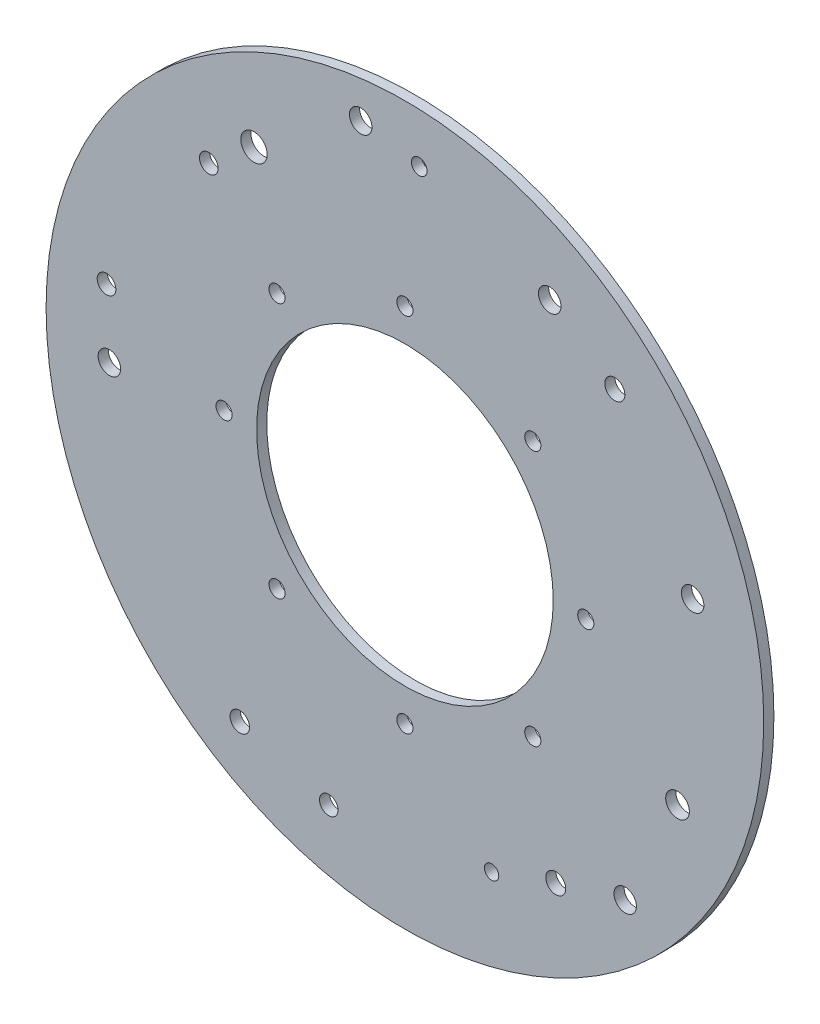
ISO-10303-21;
HEADER;
FILE_DESCRIPTION(('STEP AP214'),'2;1');
FILE_NAME('part.step','',(''),(''),'','','');
FILE_SCHEMA(('AUTOMOTIVE_DESIGN { 1 0 10303 214 1 1 1 1 }'));
ENDSEC;
DATA;
#1=APPLICATION_CONTEXT('core data for automotive mechanical design processes');
#2=APPLICATION_PROTOCOL_DEFINITION('international standard','automotive_design',2000,#1);
#3=PRODUCT_CONTEXT('',#1,'mechanical');
#4=PRODUCT('Part','Part','',(#3));
#5=PRODUCT_RELATED_PRODUCT_CATEGORY('part','',(#4));
#6=PRODUCT_DEFINITION_FORMATION('','',#4);
#7=PRODUCT_DEFINITION_CONTEXT('part definition',#1,'design');
#8=PRODUCT_DEFINITION('design','',#6,#7);
#9=PRODUCT_DEFINITION_SHAPE('','',#8);
#10=(LENGTH_UNIT() NAMED_UNIT(*) SI_UNIT(.MILLI.,.METRE.));
#11=(NAMED_UNIT(*) PLANE_ANGLE_UNIT() SI_UNIT($,.RADIAN.));
#12=(NAMED_UNIT(*) SI_UNIT($,.STERADIAN.) SOLID_ANGLE_UNIT());
#13=UNCERTAINTY_MEASURE_WITH_UNIT(LENGTH_MEASURE(1.E-05),#10,'distance_accuracy_value','');
#14=(GEOMETRIC_REPRESENTATION_CONTEXT(3) GLOBAL_UNCERTAINTY_ASSIGNED_CONTEXT((#13)) GLOBAL_UNIT_ASSIGNED_CONTEXT((#10,
#11,#12)) REPRESENTATION_CONTEXT('',''));
#15=CARTESIAN_POINT('',(0.,0.,0.));
#16=DIRECTION('',(0.,0.,1.));
#17=DIRECTION('',(1.,0.,0.));
#18=AXIS2_PLACEMENT_3D('',#15,#16,#17);
#19=CARTESIAN_POINT('',(0.,0.,6.));
#20=DIRECTION('',(0.,0.,1.));
#21=DIRECTION('',(1.,0.,0.));
#22=AXIS2_PLACEMENT_3D('',#19,#20,#21);
#23=PLANE('',#22);
#24=CARTESIAN_POINT('',(106.68,1.11741368768336E-12,6.));
#25=DIRECTION('',(0.,0.,1.));
#26=DIRECTION('',(1.,0.,0.));
#27=AXIS2_PLACEMENT_3D('',#24,#25,#26);
#28=CIRCLE('',#27,4.7625);
#29=CARTESIAN_POINT('',(111.4425,1.11741368768336E-12,6.));
#30=VERTEX_POINT('',#29);
#31=EDGE_CURVE('E183',#30,#30,#28,.T.);
#32=ORIENTED_EDGE('',*,*,#31,.F.);
#33=EDGE_LOOP('',(#32));
#34=FACE_BOUND('',#33,.T.);
#35=CARTESIAN_POINT('',(75.4341514169816,-75.4341514169802,6.));
#36=DIRECTION('',(0.,0.,1.));
#37=DIRECTION('',(1.,0.,0.));
#38=AXIS2_PLACEMENT_3D('',#35,#36,#37);
#39=CIRCLE('',#38,4.7625);
#40=CARTESIAN_POINT('',(80.1966514169816,-75.4341514169802,6.));
#41=VERTEX_POINT('',#40);
#42=EDGE_CURVE('E177',#41,#41,#39,.T.);
#43=ORIENTED_EDGE('',*,*,#42,.F.);
#44=EDGE_LOOP('',(#43));
#45=FACE_BOUND('',#44,.T.);
#46=CARTESIAN_POINT('',(0.,-106.68,6.));
#47=DIRECTION('',(0.,0.,1.));
#48=DIRECTION('',(1.,0.,0.));
#49=AXIS2_PLACEMENT_3D('',#46,#47,#48);
#50=CIRCLE('',#49,4.7625);
#51=CARTESIAN_POINT('',(4.7625,-106.68,6.));
#52=VERTEX_POINT('',#51);
#53=EDGE_CURVE('E171',#52,#52,#50,.T.);
#54=ORIENTED_EDGE('',*,*,#53,.F.);
#55=EDGE_LOOP('',(#54));
#56=FACE_BOUND('',#55,.T.);
#57=CARTESIAN_POINT('',(-75.434151416981,-75.4341514169808,6.));
#58=DIRECTION('',(0.,0.,1.));
#59=DIRECTION('',(1.,0.,0.));
#60=AXIS2_PLACEMENT_3D('',#57,#58,#59);
#61=CIRCLE('',#60,4.7625);
#62=CARTESIAN_POINT('',(-70.671651416981,-75.4341514169808,6.));
#63=VERTEX_POINT('',#62);
#64=EDGE_CURVE('E165',#63,#63,#61,.T.);
#65=ORIENTED_EDGE('',*,*,#64,.F.);
#66=EDGE_LOOP('',(#65));
#67=FACE_BOUND('',#66,.T.);
#68=CARTESIAN_POINT('',(-106.68,-3.72471229227785E-13,6.));
#69=DIRECTION('',(0.,0.,1.));
#70=DIRECTION('',(1.,0.,0.));
#71=AXIS2_PLACEMENT_3D('',#68,#69,#70);
#72=CIRCLE('',#71,4.7625);
#73=CARTESIAN_POINT('',(-101.9175,-3.72471229227785E-13,6.));
#74=VERTEX_POINT('',#73);
#75=EDGE_CURVE('E159',#74,#74,#72,.T.);
#76=ORIENTED_EDGE('',*,*,#75,.F.);
#77=EDGE_LOOP('',(#76));
#78=FACE_BOUND('',#77,.T.);
#79=CARTESIAN_POINT('',(-75.434151416981,75.4341514169808,6.));
#80=DIRECTION('',(0.,0.,1.));
#81=DIRECTION('',(1.,0.,0.));
#82=AXIS2_PLACEMENT_3D('',#79,#80,#81);
#83=CIRCLE('',#82,4.7625);
#84=CARTESIAN_POINT('',(-70.671651416981,75.4341514169808,6.));
#85=VERTEX_POINT('',#84);
#86=EDGE_CURVE('E153',#85,#85,#83,.T.);
#87=ORIENTED_EDGE('',*,*,#86,.F.);
#88=EDGE_LOOP('',(#87));
#89=FACE_BOUND('',#88,.T.);
#90=CARTESIAN_POINT('',(0.,106.68,6.));
#91=DIRECTION('',(0.,0.,1.));
#92=DIRECTION('',(1.,0.,0.));
#93=AXIS2_PLACEMENT_3D('',#90,#91,#92);
#94=CIRCLE('',#93,4.7625);
#95=CARTESIAN_POINT('',(4.7625,106.68,6.));
#96=VERTEX_POINT('',#95);
#97=EDGE_CURVE('E147',#96,#96,#94,.T.);
#98=ORIENTED_EDGE('',*,*,#97,.F.);
#99=EDGE_LOOP('',(#98));
#100=FACE_BOUND('',#99,.T.);
#101=CARTESIAN_POINT('',(75.434151416981,75.4341514169808,6.));
#102=DIRECTION('',(0.,0.,1.));
#103=DIRECTION('',(1.,0.,0.));
#104=AXIS2_PLACEMENT_3D('',#101,#102,#103);
#105=CIRCLE('',#104,4.7625);
#106=CARTESIAN_POINT('',(80.196651416981,75.4341514169808,6.));
#107=VERTEX_POINT('',#106);
#108=EDGE_CURVE('E141',#107,#107,#105,.T.);
#109=ORIENTED_EDGE('',*,*,#108,.F.);
#110=EDGE_LOOP('',(#109));
#111=FACE_BOUND('',#110,.T.);
#112=CARTESIAN_POINT('',(0.,0.,6.));
#113=DIRECTION('',(0.,0.,1.));
#114=DIRECTION('',(1.,0.,0.));
#115=AXIS2_PLACEMENT_3D('',#112,#113,#114);
#116=CIRCLE('',#115,87.5);
#117=CARTESIAN_POINT('',(87.5,0.,6.));
#118=VERTEX_POINT('',#117);
#119=EDGE_CURVE('E133',#118,#118,#116,.T.);
#120=ORIENTED_EDGE('',*,*,#119,.F.);
#121=EDGE_LOOP('',(#120));
#122=FACE_BOUND('',#121,.T.);
#123=CARTESIAN_POINT('',(169.7101,41.9354,6.));
#124=DIRECTION('',(0.,0.,1.));
#125=DIRECTION('',(1.,0.,0.));
#126=AXIS2_PLACEMENT_3D('',#123,#124,#125);
#127=CIRCLE('',#126,6.6421);
#128=CARTESIAN_POINT('',(176.3522,41.9354,6.));
#129=VERTEX_POINT('',#128);
#130=EDGE_CURVE('E118',#129,#129,#127,.T.);
#131=ORIENTED_EDGE('',*,*,#130,.F.);
#132=EDGE_LOOP('',(#131));
#133=FACE_BOUND('',#132,.T.);
#134=CARTESIAN_POINT('',(85.42274,152.58034,6.));
#135=DIRECTION('',(0.,0.,1.));
#136=DIRECTION('',(1.,0.,0.));
#137=AXIS2_PLACEMENT_3D('',#134,#135,#136);
#138=CIRCLE('',#137,6.6421);
#139=CARTESIAN_POINT('',(92.06484,152.58034,6.));
#140=VERTEX_POINT('',#139);
#141=EDGE_CURVE('E106',#140,#140,#138,.T.);
#142=ORIENTED_EDGE('',*,*,#141,.F.);
#143=EDGE_LOOP('',(#142));
#144=FACE_BOUND('',#143,.T.);
#145=CARTESIAN_POINT('',(-26.09596,188.2775,6.));
#146=DIRECTION('',(0.,0.,1.));
#147=DIRECTION('',(1.,0.,0.));
#148=AXIS2_PLACEMENT_3D('',#145,#146,#147);
#149=CIRCLE('',#148,6.64209999999999);
#150=CARTESIAN_POINT('',(-19.45386,188.2775,6.));
#151=VERTEX_POINT('',#150);
#152=EDGE_CURVE('E94',#151,#151,#149,.T.);
#153=ORIENTED_EDGE('',*,*,#152,.F.);
#154=EDGE_LOOP('',(#153));
#155=FACE_BOUND('',#154,.T.);
#156=CARTESIAN_POINT('',(-176.0118908,29.95676,6.));
#157=DIRECTION('',(0.,0.,1.));
#158=DIRECTION('',(1.,0.,0.));
#159=AXIS2_PLACEMENT_3D('',#156,#157,#158);
#160=CIRCLE('',#159,5.49910000000001);
#161=CARTESIAN_POINT('',(-170.5127908,29.95676,6.));
#162=VERTEX_POINT('',#161);
#163=EDGE_CURVE('E82',#162,#162,#160,.T.);
#164=ORIENTED_EDGE('',*,*,#163,.F.);
#165=EDGE_LOOP('',(#164));
#166=FACE_BOUND('',#165,.T.);
#167=CARTESIAN_POINT('',(-97.40392,-154.3431,6.));
#168=DIRECTION('',(0.,0.,1.));
#169=DIRECTION('',(1.,0.,0.));
#170=AXIS2_PLACEMENT_3D('',#167,#168,#169);
#171=CIRCLE('',#170,5.7531);
#172=CARTESIAN_POINT('',(-91.65082,-154.3431,6.));
#173=VERTEX_POINT('',#172);
#174=EDGE_CURVE('E70',#173,#173,#171,.T.);
#175=ORIENTED_EDGE('',*,*,#174,.F.);
#176=EDGE_LOOP('',(#175));
#177=FACE_BOUND('',#176,.T.);
#178=CARTESIAN_POINT('',(51.13274,-156.81706,6.));
#179=DIRECTION('',(0.,0.,1.));
#180=DIRECTION('',(1.,0.,0.));
#181=AXIS2_PLACEMENT_3D('',#178,#179,#180);
#182=CIRCLE('',#181,4.2291);
#183=CARTESIAN_POINT('',(55.36184,-156.81706,6.));
#184=VERTEX_POINT('',#183);
#185=EDGE_CURVE('E58',#184,#184,#182,.T.);
#186=ORIENTED_EDGE('',*,*,#185,.F.);
#187=EDGE_LOOP('',(#186));
#188=FACE_BOUND('',#187,.T.);
#189=CARTESIAN_POINT('',(129.93116,-131.74726,6.));
#190=DIRECTION('',(0.,0.,1.));
#191=DIRECTION('',(1.,0.,0.));
#192=AXIS2_PLACEMENT_3D('',#189,#190,#191);
#193=CIRCLE('',#192,6.6294);
#194=CARTESIAN_POINT('',(136.56056,-131.74726,6.));
#195=VERTEX_POINT('',#194);
#196=EDGE_CURVE('E46',#195,#195,#193,.T.);
#197=ORIENTED_EDGE('',*,*,#196,.F.);
#198=EDGE_LOOP('',(#197));
#199=FACE_BOUND('',#198,.T.);
#200=CARTESIAN_POINT('',(0.,0.,6.));
#201=DIRECTION('',(0.,0.,1.));
#202=DIRECTION('',(1.,0.,0.));
#203=AXIS2_PLACEMENT_3D('',#200,#201,#202);
#204=CIRCLE('',#203,211.670411634821);
#205=CARTESIAN_POINT('',(211.670411634821,0.,6.));
#206=VERTEX_POINT('',#205);
#207=EDGE_CURVE('E10',#206,#206,#204,.T.);
#208=ORIENTED_EDGE('',*,*,#207,.T.);
#209=EDGE_LOOP('',(#208));
#210=FACE_BOUND('',#209,.T.);
#211=CARTESIAN_POINT('',(160.80232,-67.72402,6.));
#212=DIRECTION('',(0.,0.,1.));
#213=DIRECTION('',(1.,0.,0.));
#214=AXIS2_PLACEMENT_3D('',#211,#212,#213);
#215=CIRCLE('',#214,6.98499999999998);
#216=CARTESIAN_POINT('',(167.78732,-67.72402,6.));
#217=VERTEX_POINT('',#216);
#218=EDGE_CURVE('E41',#217,#217,#215,.T.);
#219=ORIENTED_EDGE('',*,*,#218,.F.);
#220=EDGE_LOOP('',(#219));
#221=FACE_BOUND('',#220,.T.);
#222=CARTESIAN_POINT('',(88.98382,-143.60906,6.));
#223=DIRECTION('',(0.,0.,1.));
#224=DIRECTION('',(1.,0.,0.));
#225=AXIS2_PLACEMENT_3D('',#222,#223,#224);
#226=CIRCLE('',#225,5.8928);
#227=CARTESIAN_POINT('',(94.87662,-143.60906,6.));
#228=VERTEX_POINT('',#227);
#229=EDGE_CURVE('E52',#228,#228,#226,.T.);
#230=ORIENTED_EDGE('',*,*,#229,.F.);
#231=EDGE_LOOP('',(#230));
#232=FACE_BOUND('',#231,.T.);
#233=CARTESIAN_POINT('',(-44.93006,-170.61434,6.));
#234=DIRECTION('',(0.,0.,1.));
#235=DIRECTION('',(1.,0.,0.));
#236=AXIS2_PLACEMENT_3D('',#233,#234,#235);
#237=CIRCLE('',#236,5.461);
#238=CARTESIAN_POINT('',(-39.46906,-170.61434,6.));
#239=VERTEX_POINT('',#238);
#240=EDGE_CURVE('E64',#239,#239,#237,.T.);
#241=ORIENTED_EDGE('',*,*,#240,.F.);
#242=EDGE_LOOP('',(#241));
#243=FACE_BOUND('',#242,.T.);
#244=CARTESIAN_POINT('',(-174.33036,-9.32688,6.));
#245=DIRECTION('',(0.,0.,1.));
#246=DIRECTION('',(1.,0.,0.));
#247=AXIS2_PLACEMENT_3D('',#244,#245,#246);
#248=CIRCLE('',#247,6.6294);
#249=CARTESIAN_POINT('',(-167.70096,-9.32688,6.));
#250=VERTEX_POINT('',#249);
#251=EDGE_CURVE('E76',#250,#250,#248,.T.);
#252=ORIENTED_EDGE('',*,*,#251,.F.);
#253=EDGE_LOOP('',(#252));
#254=FACE_BOUND('',#253,.T.);
#255=CARTESIAN_POINT('',(-89.03716,143.4338,6.));
#256=DIRECTION('',(0.,0.,1.));
#257=DIRECTION('',(1.,0.,0.));
#258=AXIS2_PLACEMENT_3D('',#255,#256,#257);
#259=CIRCLE('',#258,7.79779999999999);
#260=CARTESIAN_POINT('',(-81.23936,143.4338,6.));
#261=VERTEX_POINT('',#260);
#262=EDGE_CURVE('E88',#261,#261,#259,.T.);
#263=ORIENTED_EDGE('',*,*,#262,.F.);
#264=EDGE_LOOP('',(#263));
#265=FACE_BOUND('',#264,.T.);
#266=CARTESIAN_POINT('',(8.42771999999997,182.19674,6.));
#267=DIRECTION('',(0.,0.,1.));
#268=DIRECTION('',(1.,0.,0.));
#269=AXIS2_PLACEMENT_3D('',#266,#267,#268);
#270=CIRCLE('',#269,4.6228);
#271=CARTESIAN_POINT('',(13.05052,182.19674,6.));
#272=VERTEX_POINT('',#271);
#273=EDGE_CURVE('E100',#272,#272,#270,.T.);
#274=ORIENTED_EDGE('',*,*,#273,.F.);
#275=EDGE_LOOP('',(#274));
#276=FACE_BOUND('',#275,.T.);
#277=CARTESIAN_POINT('',(123.8123,126.18466,6.));
#278=DIRECTION('',(0.,0.,1.));
#279=DIRECTION('',(1.,0.,0.));
#280=AXIS2_PLACEMENT_3D('',#277,#278,#279);
#281=CIRCLE('',#280,5.91819999999999);
#282=CARTESIAN_POINT('',(129.7305,126.18466,6.));
#283=VERTEX_POINT('',#282);
#284=EDGE_CURVE('E112',#283,#283,#281,.T.);
#285=ORIENTED_EDGE('',*,*,#284,.F.);
#286=EDGE_LOOP('',(#285));
#287=FACE_BOUND('',#286,.T.);
#288=CARTESIAN_POINT('',(-115.69192,121.86666,6.));
#289=DIRECTION('',(0.,0.,1.));
#290=DIRECTION('',(1.,0.,0.));
#291=AXIS2_PLACEMENT_3D('',#288,#289,#290);
#292=CIRCLE('',#291,5.49910000000001);
#293=CARTESIAN_POINT('',(-110.19282,121.86666,6.));
#294=VERTEX_POINT('',#293);
#295=EDGE_CURVE('E124',#294,#294,#292,.T.);
#296=ORIENTED_EDGE('',*,*,#295,.F.);
#297=EDGE_LOOP('',(#296));
#298=FACE_BOUND('',#297,.T.);
#299=ADVANCED_FACE('F30',(#34,#45,#56,#67,#78,#89,#100,#111,#122,#133,#144,#155,#166,#177,#188,
#199,#210,#221,#232,#243,#254,#265,#276,#287,#298),#23,.T.);
#300=CARTESIAN_POINT('',(0.,0.,0.));
#301=DIRECTION('',(0.,0.,1.));
#302=DIRECTION('',(1.,0.,0.));
#303=AXIS2_PLACEMENT_3D('',#300,#301,#302);
#304=PLANE('',#303);
#305=CARTESIAN_POINT('',(106.68,1.11741368768336E-12,0.));
#306=DIRECTION('',(0.,0.,1.));
#307=DIRECTION('',(1.,0.,0.));
#308=AXIS2_PLACEMENT_3D('',#305,#306,#307);
#309=CIRCLE('',#308,4.7625);
#310=CARTESIAN_POINT('',(111.4425,1.11741368768336E-12,0.));
#311=VERTEX_POINT('',#310);
#312=EDGE_CURVE('E180',#311,#311,#309,.T.);
#313=ORIENTED_EDGE('',*,*,#312,.T.);
#314=EDGE_LOOP('',(#313));
#315=FACE_BOUND('',#314,.T.);
#316=CARTESIAN_POINT('',(75.4341514169816,-75.4341514169802,0.));
#317=DIRECTION('',(0.,0.,1.));
#318=DIRECTION('',(1.,0.,0.));
#319=AXIS2_PLACEMENT_3D('',#316,#317,#318);
#320=CIRCLE('',#319,4.7625);
#321=CARTESIAN_POINT('',(80.1966514169816,-75.4341514169802,0.));
#322=VERTEX_POINT('',#321);
#323=EDGE_CURVE('E174',#322,#322,#320,.T.);
#324=ORIENTED_EDGE('',*,*,#323,.T.);
#325=EDGE_LOOP('',(#324));
#326=FACE_BOUND('',#325,.T.);
#327=CARTESIAN_POINT('',(0.,-106.68,0.));
#328=DIRECTION('',(0.,0.,1.));
#329=DIRECTION('',(1.,0.,0.));
#330=AXIS2_PLACEMENT_3D('',#327,#328,#329);
#331=CIRCLE('',#330,4.7625);
#332=CARTESIAN_POINT('',(4.7625,-106.68,0.));
#333=VERTEX_POINT('',#332);
#334=EDGE_CURVE('E168',#333,#333,#331,.T.);
#335=ORIENTED_EDGE('',*,*,#334,.T.);
#336=EDGE_LOOP('',(#335));
#337=FACE_BOUND('',#336,.T.);
#338=CARTESIAN_POINT('',(-75.434151416981,-75.4341514169808,0.));
#339=DIRECTION('',(0.,0.,1.));
#340=DIRECTION('',(1.,0.,0.));
#341=AXIS2_PLACEMENT_3D('',#338,#339,#340);
#342=CIRCLE('',#341,4.7625);
#343=CARTESIAN_POINT('',(-70.671651416981,-75.4341514169808,0.));
#344=VERTEX_POINT('',#343);
#345=EDGE_CURVE('E162',#344,#344,#342,.T.);
#346=ORIENTED_EDGE('',*,*,#345,.T.);
#347=EDGE_LOOP('',(#346));
#348=FACE_BOUND('',#347,.T.);
#349=CARTESIAN_POINT('',(-106.68,-3.72471229227785E-13,0.));
#350=DIRECTION('',(0.,0.,1.));
#351=DIRECTION('',(1.,0.,0.));
#352=AXIS2_PLACEMENT_3D('',#349,#350,#351);
#353=CIRCLE('',#352,4.7625);
#354=CARTESIAN_POINT('',(-101.9175,-3.72471229227785E-13,0.));
#355=VERTEX_POINT('',#354);
#356=EDGE_CURVE('E156',#355,#355,#353,.T.);
#357=ORIENTED_EDGE('',*,*,#356,.T.);
#358=EDGE_LOOP('',(#357));
#359=FACE_BOUND('',#358,.T.);
#360=CARTESIAN_POINT('',(-75.434151416981,75.4341514169808,0.));
#361=DIRECTION('',(0.,0.,1.));
#362=DIRECTION('',(1.,0.,0.));
#363=AXIS2_PLACEMENT_3D('',#360,#361,#362);
#364=CIRCLE('',#363,4.7625);
#365=CARTESIAN_POINT('',(-70.671651416981,75.4341514169808,0.));
#366=VERTEX_POINT('',#365);
#367=EDGE_CURVE('E150',#366,#366,#364,.T.);
#368=ORIENTED_EDGE('',*,*,#367,.T.);
#369=EDGE_LOOP('',(#368));
#370=FACE_BOUND('',#369,.T.);
#371=CARTESIAN_POINT('',(0.,106.68,0.));
#372=DIRECTION('',(0.,0.,1.));
#373=DIRECTION('',(1.,0.,0.));
#374=AXIS2_PLACEMENT_3D('',#371,#372,#373);
#375=CIRCLE('',#374,4.7625);
#376=CARTESIAN_POINT('',(4.7625,106.68,0.));
#377=VERTEX_POINT('',#376);
#378=EDGE_CURVE('E144',#377,#377,#375,.T.);
#379=ORIENTED_EDGE('',*,*,#378,.T.);
#380=EDGE_LOOP('',(#379));
#381=FACE_BOUND('',#380,.T.);
#382=CARTESIAN_POINT('',(75.434151416981,75.4341514169808,0.));
#383=DIRECTION('',(0.,0.,1.));
#384=DIRECTION('',(1.,0.,0.));
#385=AXIS2_PLACEMENT_3D('',#382,#383,#384);
#386=CIRCLE('',#385,4.7625);
#387=CARTESIAN_POINT('',(80.196651416981,75.4341514169808,0.));
#388=VERTEX_POINT('',#387);
#389=EDGE_CURVE('E136',#388,#388,#386,.T.);
#390=ORIENTED_EDGE('',*,*,#389,.T.);
#391=EDGE_LOOP('',(#390));
#392=FACE_BOUND('',#391,.T.);
#393=CARTESIAN_POINT('',(0.,0.,0.));
#394=DIRECTION('',(0.,0.,1.));
#395=DIRECTION('',(1.,0.,0.));
#396=AXIS2_PLACEMENT_3D('',#393,#394,#395);
#397=CIRCLE('',#396,87.5);
#398=CARTESIAN_POINT('',(87.5,0.,0.));
#399=VERTEX_POINT('',#398);
#400=EDGE_CURVE('E130',#399,#399,#397,.T.);
#401=ORIENTED_EDGE('',*,*,#400,.T.);
#402=EDGE_LOOP('',(#401));
#403=FACE_BOUND('',#402,.T.);
#404=CARTESIAN_POINT('',(0.,0.,0.));
#405=DIRECTION('',(0.,0.,1.));
#406=DIRECTION('',(1.,0.,0.));
#407=AXIS2_PLACEMENT_3D('',#404,#405,#406);
#408=CIRCLE('',#407,211.670411634821);
#409=CARTESIAN_POINT('',(211.670411634821,0.,0.));
#410=VERTEX_POINT('',#409);
#411=EDGE_CURVE('E34',#410,#410,#408,.T.);
#412=ORIENTED_EDGE('',*,*,#411,.F.);
#413=EDGE_LOOP('',(#412));
#414=FACE_BOUND('',#413,.T.);
#415=CARTESIAN_POINT('',(160.80232,-67.72402,0.));
#416=DIRECTION('',(0.,0.,1.));
#417=DIRECTION('',(1.,0.,0.));
#418=AXIS2_PLACEMENT_3D('',#415,#416,#417);
#419=CIRCLE('',#418,6.98499999999998);
#420=CARTESIAN_POINT('',(167.78732,-67.72402,0.));
#421=VERTEX_POINT('',#420);
#422=EDGE_CURVE('E43',#421,#421,#419,.T.);
#423=ORIENTED_EDGE('',*,*,#422,.T.);
#424=EDGE_LOOP('',(#423));
#425=FACE_BOUND('',#424,.T.);
#426=CARTESIAN_POINT('',(129.93116,-131.74726,0.));
#427=DIRECTION('',(0.,0.,1.));
#428=DIRECTION('',(1.,0.,0.));
#429=AXIS2_PLACEMENT_3D('',#426,#427,#428);
#430=CIRCLE('',#429,6.6294);
#431=CARTESIAN_POINT('',(136.56056,-131.74726,0.));
#432=VERTEX_POINT('',#431);
#433=EDGE_CURVE('E49',#432,#432,#430,.T.);
#434=ORIENTED_EDGE('',*,*,#433,.T.);
#435=EDGE_LOOP('',(#434));
#436=FACE_BOUND('',#435,.T.);
#437=CARTESIAN_POINT('',(88.98382,-143.60906,0.));
#438=DIRECTION('',(0.,0.,1.));
#439=DIRECTION('',(1.,0.,0.));
#440=AXIS2_PLACEMENT_3D('',#437,#438,#439);
#441=CIRCLE('',#440,5.8928);
#442=CARTESIAN_POINT('',(94.87662,-143.60906,0.));
#443=VERTEX_POINT('',#442);
#444=EDGE_CURVE('E55',#443,#443,#441,.T.);
#445=ORIENTED_EDGE('',*,*,#444,.T.);
#446=EDGE_LOOP('',(#445));
#447=FACE_BOUND('',#446,.T.);
#448=CARTESIAN_POINT('',(51.13274,-156.81706,0.));
#449=DIRECTION('',(0.,0.,1.));
#450=DIRECTION('',(1.,0.,0.));
#451=AXIS2_PLACEMENT_3D('',#448,#449,#450);
#452=CIRCLE('',#451,4.2291);
#453=CARTESIAN_POINT('',(55.36184,-156.81706,0.));
#454=VERTEX_POINT('',#453);
#455=EDGE_CURVE('E61',#454,#454,#452,.T.);
#456=ORIENTED_EDGE('',*,*,#455,.T.);
#457=EDGE_LOOP('',(#456));
#458=FACE_BOUND('',#457,.T.);
#459=CARTESIAN_POINT('',(-44.93006,-170.61434,0.));
#460=DIRECTION('',(0.,0.,1.));
#461=DIRECTION('',(1.,0.,0.));
#462=AXIS2_PLACEMENT_3D('',#459,#460,#461);
#463=CIRCLE('',#462,5.461);
#464=CARTESIAN_POINT('',(-39.46906,-170.61434,0.));
#465=VERTEX_POINT('',#464);
#466=EDGE_CURVE('E67',#465,#465,#463,.T.);
#467=ORIENTED_EDGE('',*,*,#466,.T.);
#468=EDGE_LOOP('',(#467));
#469=FACE_BOUND('',#468,.T.);
#470=CARTESIAN_POINT('',(-97.40392,-154.3431,0.));
#471=DIRECTION('',(0.,0.,1.));
#472=DIRECTION('',(1.,0.,0.));
#473=AXIS2_PLACEMENT_3D('',#470,#471,#472);
#474=CIRCLE('',#473,5.7531);
#475=CARTESIAN_POINT('',(-91.65082,-154.3431,0.));
#476=VERTEX_POINT('',#475);
#477=EDGE_CURVE('E73',#476,#476,#474,.T.);
#478=ORIENTED_EDGE('',*,*,#477,.T.);
#479=EDGE_LOOP('',(#478));
#480=FACE_BOUND('',#479,.T.);
#481=CARTESIAN_POINT('',(-174.33036,-9.32688,0.));
#482=DIRECTION('',(0.,0.,1.));
#483=DIRECTION('',(1.,0.,0.));
#484=AXIS2_PLACEMENT_3D('',#481,#482,#483);
#485=CIRCLE('',#484,6.6294);
#486=CARTESIAN_POINT('',(-167.70096,-9.32688,0.));
#487=VERTEX_POINT('',#486);
#488=EDGE_CURVE('E79',#487,#487,#485,.T.);
#489=ORIENTED_EDGE('',*,*,#488,.T.);
#490=EDGE_LOOP('',(#489));
#491=FACE_BOUND('',#490,.T.);
#492=CARTESIAN_POINT('',(-176.0118908,29.95676,0.));
#493=DIRECTION('',(0.,0.,1.));
#494=DIRECTION('',(1.,0.,0.));
#495=AXIS2_PLACEMENT_3D('',#492,#493,#494);
#496=CIRCLE('',#495,5.49910000000001);
#497=CARTESIAN_POINT('',(-170.5127908,29.95676,0.));
#498=VERTEX_POINT('',#497);
#499=EDGE_CURVE('E85',#498,#498,#496,.T.);
#500=ORIENTED_EDGE('',*,*,#499,.T.);
#501=EDGE_LOOP('',(#500));
#502=FACE_BOUND('',#501,.T.);
#503=CARTESIAN_POINT('',(-89.03716,143.4338,0.));
#504=DIRECTION('',(0.,0.,1.));
#505=DIRECTION('',(1.,0.,0.));
#506=AXIS2_PLACEMENT_3D('',#503,#504,#505);
#507=CIRCLE('',#506,7.79779999999999);
#508=CARTESIAN_POINT('',(-81.23936,143.4338,0.));
#509=VERTEX_POINT('',#508);
#510=EDGE_CURVE('E91',#509,#509,#507,.T.);
#511=ORIENTED_EDGE('',*,*,#510,.T.);
#512=EDGE_LOOP('',(#511));
#513=FACE_BOUND('',#512,.T.);
#514=CARTESIAN_POINT('',(-26.09596,188.2775,0.));
#515=DIRECTION('',(0.,0.,1.));
#516=DIRECTION('',(1.,0.,0.));
#517=AXIS2_PLACEMENT_3D('',#514,#515,#516);
#518=CIRCLE('',#517,6.64209999999999);
#519=CARTESIAN_POINT('',(-19.45386,188.2775,0.));
#520=VERTEX_POINT('',#519);
#521=EDGE_CURVE('E97',#520,#520,#518,.T.);
#522=ORIENTED_EDGE('',*,*,#521,.T.);
#523=EDGE_LOOP('',(#522));
#524=FACE_BOUND('',#523,.T.);
#525=CARTESIAN_POINT('',(8.42771999999997,182.19674,0.));
#526=DIRECTION('',(0.,0.,1.));
#527=DIRECTION('',(1.,0.,0.));
#528=AXIS2_PLACEMENT_3D('',#525,#526,#527);
#529=CIRCLE('',#528,4.6228);
#530=CARTESIAN_POINT('',(13.05052,182.19674,0.));
#531=VERTEX_POINT('',#530);
#532=EDGE_CURVE('E103',#531,#531,#529,.T.);
#533=ORIENTED_EDGE('',*,*,#532,.T.);
#534=EDGE_LOOP('',(#533));
#535=FACE_BOUND('',#534,.T.);
#536=CARTESIAN_POINT('',(85.42274,152.58034,0.));
#537=DIRECTION('',(0.,0.,1.));
#538=DIRECTION('',(1.,0.,0.));
#539=AXIS2_PLACEMENT_3D('',#536,#537,#538);
#540=CIRCLE('',#539,6.6421);
#541=CARTESIAN_POINT('',(92.06484,152.58034,0.));
#542=VERTEX_POINT('',#541);
#543=EDGE_CURVE('E109',#542,#542,#540,.T.);
#544=ORIENTED_EDGE('',*,*,#543,.T.);
#545=EDGE_LOOP('',(#544));
#546=FACE_BOUND('',#545,.T.);
#547=CARTESIAN_POINT('',(123.8123,126.18466,0.));
#548=DIRECTION('',(0.,0.,1.));
#549=DIRECTION('',(1.,0.,0.));
#550=AXIS2_PLACEMENT_3D('',#547,#548,#549);
#551=CIRCLE('',#550,5.91819999999999);
#552=CARTESIAN_POINT('',(129.7305,126.18466,0.));
#553=VERTEX_POINT('',#552);
#554=EDGE_CURVE('E115',#553,#553,#551,.T.);
#555=ORIENTED_EDGE('',*,*,#554,.T.);
#556=EDGE_LOOP('',(#555));
#557=FACE_BOUND('',#556,.T.);
#558=CARTESIAN_POINT('',(169.7101,41.9354,0.));
#559=DIRECTION('',(0.,0.,1.));
#560=DIRECTION('',(1.,0.,0.));
#561=AXIS2_PLACEMENT_3D('',#558,#559,#560);
#562=CIRCLE('',#561,6.6421);
#563=CARTESIAN_POINT('',(176.3522,41.9354,0.));
#564=VERTEX_POINT('',#563);
#565=EDGE_CURVE('E121',#564,#564,#562,.T.);
#566=ORIENTED_EDGE('',*,*,#565,.T.);
#567=EDGE_LOOP('',(#566));
#568=FACE_BOUND('',#567,.T.);
#569=CARTESIAN_POINT('',(-115.69192,121.86666,0.));
#570=DIRECTION('',(0.,0.,1.));
#571=DIRECTION('',(1.,0.,0.));
#572=AXIS2_PLACEMENT_3D('',#569,#570,#571);
#573=CIRCLE('',#572,5.49910000000001);
#574=CARTESIAN_POINT('',(-110.19282,121.86666,0.));
#575=VERTEX_POINT('',#574);
#576=EDGE_CURVE('E127',#575,#575,#573,.T.);
#577=ORIENTED_EDGE('',*,*,#576,.T.);
#578=EDGE_LOOP('',(#577));
#579=FACE_BOUND('',#578,.T.);
#580=ADVANCED_FACE('F191',(#315,#326,#337,#348,#359,#370,#381,#392,#403,#414,#425,#436,#447,
#458,#469,#480,#491,#502,#513,#524,#535,#546,#557,#568,#579),#304,.F.);
#581=CARTESIAN_POINT('',(0.,0.,6.));
#582=DIRECTION('',(0.,0.,-1.));
#583=DIRECTION('',(-1.,0.,0.));
#584=AXIS2_PLACEMENT_3D('',#581,#582,#583);
#585=CYLINDRICAL_SURFACE('',#584,211.670411634821);
#586=ORIENTED_EDGE('',*,*,#207,.F.);
#587=EDGE_LOOP('',(#586));
#588=FACE_BOUND('',#587,.T.);
#589=ORIENTED_EDGE('',*,*,#411,.T.);
#590=EDGE_LOOP('',(#589));
#591=FACE_BOUND('',#590,.T.);
#592=ADVANCED_FACE('F32',(#588,#591),#585,.T.);
#593=CARTESIAN_POINT('',(160.80232,-67.72402,6.));
#594=DIRECTION('',(0.,0.,-1.));
#595=DIRECTION('',(-1.,0.,0.));
#596=AXIS2_PLACEMENT_3D('',#593,#594,#595);
#597=CYLINDRICAL_SURFACE('',#596,6.98499999999998);
#598=ORIENTED_EDGE('',*,*,#218,.T.);
#599=EDGE_LOOP('',(#598));
#600=FACE_BOUND('',#599,.T.);
#601=ORIENTED_EDGE('',*,*,#422,.F.);
#602=EDGE_LOOP('',(#601));
#603=FACE_BOUND('',#602,.T.);
#604=ADVANCED_FACE('F252',(#600,#603),#597,.F.);
#605=CARTESIAN_POINT('',(129.93116,-131.74726,6.));
#606=DIRECTION('',(0.,0.,-1.));
#607=DIRECTION('',(-1.,0.,0.));
#608=AXIS2_PLACEMENT_3D('',#605,#606,#607);
#609=CYLINDRICAL_SURFACE('',#608,6.6294);
#610=ORIENTED_EDGE('',*,*,#196,.T.);
#611=EDGE_LOOP('',(#610));
#612=FACE_BOUND('',#611,.T.);
#613=ORIENTED_EDGE('',*,*,#433,.F.);
#614=EDGE_LOOP('',(#613));
#615=FACE_BOUND('',#614,.T.);
#616=ADVANCED_FACE('F258',(#612,#615),#609,.F.);
#617=CARTESIAN_POINT('',(88.98382,-143.60906,6.));
#618=DIRECTION('',(0.,0.,-1.));
#619=DIRECTION('',(-1.,0.,0.));
#620=AXIS2_PLACEMENT_3D('',#617,#618,#619);
#621=CYLINDRICAL_SURFACE('',#620,5.8928);
#622=ORIENTED_EDGE('',*,*,#229,.T.);
#623=EDGE_LOOP('',(#622));
#624=FACE_BOUND('',#623,.T.);
#625=ORIENTED_EDGE('',*,*,#444,.F.);
#626=EDGE_LOOP('',(#625));
#627=FACE_BOUND('',#626,.T.);
#628=ADVANCED_FACE('F262',(#624,#627),#621,.F.);
#629=CARTESIAN_POINT('',(51.13274,-156.81706,6.));
#630=DIRECTION('',(0.,0.,-1.));
#631=DIRECTION('',(-1.,0.,0.));
#632=AXIS2_PLACEMENT_3D('',#629,#630,#631);
#633=CYLINDRICAL_SURFACE('',#632,4.2291);
#634=ORIENTED_EDGE('',*,*,#185,.T.);
#635=EDGE_LOOP('',(#634));
#636=FACE_BOUND('',#635,.T.);
#637=ORIENTED_EDGE('',*,*,#455,.F.);
#638=EDGE_LOOP('',(#637));
#639=FACE_BOUND('',#638,.T.);
#640=ADVANCED_FACE('F266',(#636,#639),#633,.F.);
#641=CARTESIAN_POINT('',(-44.93006,-170.61434,6.));
#642=DIRECTION('',(0.,0.,-1.));
#643=DIRECTION('',(-1.,0.,0.));
#644=AXIS2_PLACEMENT_3D('',#641,#642,#643);
#645=CYLINDRICAL_SURFACE('',#644,5.461);
#646=ORIENTED_EDGE('',*,*,#240,.T.);
#647=EDGE_LOOP('',(#646));
#648=FACE_BOUND('',#647,.T.);
#649=ORIENTED_EDGE('',*,*,#466,.F.);
#650=EDGE_LOOP('',(#649));
#651=FACE_BOUND('',#650,.T.);
#652=ADVANCED_FACE('F270',(#648,#651),#645,.F.);
#653=CARTESIAN_POINT('',(-97.40392,-154.3431,6.));
#654=DIRECTION('',(0.,0.,-1.));
#655=DIRECTION('',(-1.,0.,0.));
#656=AXIS2_PLACEMENT_3D('',#653,#654,#655);
#657=CYLINDRICAL_SURFACE('',#656,5.7531);
#658=ORIENTED_EDGE('',*,*,#174,.T.);
#659=EDGE_LOOP('',(#658));
#660=FACE_BOUND('',#659,.T.);
#661=ORIENTED_EDGE('',*,*,#477,.F.);
#662=EDGE_LOOP('',(#661));
#663=FACE_BOUND('',#662,.T.);
#664=ADVANCED_FACE('F274',(#660,#663),#657,.F.);
#665=CARTESIAN_POINT('',(-174.33036,-9.32688,6.));
#666=DIRECTION('',(0.,0.,-1.));
#667=DIRECTION('',(-1.,0.,0.));
#668=AXIS2_PLACEMENT_3D('',#665,#666,#667);
#669=CYLINDRICAL_SURFACE('',#668,6.6294);
#670=ORIENTED_EDGE('',*,*,#251,.T.);
#671=EDGE_LOOP('',(#670));
#672=FACE_BOUND('',#671,.T.);
#673=ORIENTED_EDGE('',*,*,#488,.F.);
#674=EDGE_LOOP('',(#673));
#675=FACE_BOUND('',#674,.T.);
#676=ADVANCED_FACE('F278',(#672,#675),#669,.F.);
#677=CARTESIAN_POINT('',(-176.0118908,29.95676,6.));
#678=DIRECTION('',(0.,0.,-1.));
#679=DIRECTION('',(-1.,0.,0.));
#680=AXIS2_PLACEMENT_3D('',#677,#678,#679);
#681=CYLINDRICAL_SURFACE('',#680,5.49910000000001);
#682=ORIENTED_EDGE('',*,*,#163,.T.);
#683=EDGE_LOOP('',(#682));
#684=FACE_BOUND('',#683,.T.);
#685=ORIENTED_EDGE('',*,*,#499,.F.);
#686=EDGE_LOOP('',(#685));
#687=FACE_BOUND('',#686,.T.);
#688=ADVANCED_FACE('F282',(#684,#687),#681,.F.);
#689=CARTESIAN_POINT('',(-89.03716,143.4338,6.));
#690=DIRECTION('',(0.,0.,-1.));
#691=DIRECTION('',(-1.,0.,0.));
#692=AXIS2_PLACEMENT_3D('',#689,#690,#691);
#693=CYLINDRICAL_SURFACE('',#692,7.79779999999999);
#694=ORIENTED_EDGE('',*,*,#262,.T.);
#695=EDGE_LOOP('',(#694));
#696=FACE_BOUND('',#695,.T.);
#697=ORIENTED_EDGE('',*,*,#510,.F.);
#698=EDGE_LOOP('',(#697));
#699=FACE_BOUND('',#698,.T.);
#700=ADVANCED_FACE('F286',(#696,#699),#693,.F.);
#701=CARTESIAN_POINT('',(-26.09596,188.2775,6.));
#702=DIRECTION('',(0.,0.,-1.));
#703=DIRECTION('',(-1.,0.,0.));
#704=AXIS2_PLACEMENT_3D('',#701,#702,#703);
#705=CYLINDRICAL_SURFACE('',#704,6.64209999999999);
#706=ORIENTED_EDGE('',*,*,#152,.T.);
#707=EDGE_LOOP('',(#706));
#708=FACE_BOUND('',#707,.T.);
#709=ORIENTED_EDGE('',*,*,#521,.F.);
#710=EDGE_LOOP('',(#709));
#711=FACE_BOUND('',#710,.T.);
#712=ADVANCED_FACE('F290',(#708,#711),#705,.F.);
#713=CARTESIAN_POINT('',(8.42771999999997,182.19674,6.));
#714=DIRECTION('',(0.,0.,-1.));
#715=DIRECTION('',(-1.,0.,0.));
#716=AXIS2_PLACEMENT_3D('',#713,#714,#715);
#717=CYLINDRICAL_SURFACE('',#716,4.6228);
#718=ORIENTED_EDGE('',*,*,#273,.T.);
#719=EDGE_LOOP('',(#718));
#720=FACE_BOUND('',#719,.T.);
#721=ORIENTED_EDGE('',*,*,#532,.F.);
#722=EDGE_LOOP('',(#721));
#723=FACE_BOUND('',#722,.T.);
#724=ADVANCED_FACE('F294',(#720,#723),#717,.F.);
#725=CARTESIAN_POINT('',(85.42274,152.58034,6.));
#726=DIRECTION('',(0.,0.,-1.));
#727=DIRECTION('',(-1.,0.,0.));
#728=AXIS2_PLACEMENT_3D('',#725,#726,#727);
#729=CYLINDRICAL_SURFACE('',#728,6.6421);
#730=ORIENTED_EDGE('',*,*,#141,.T.);
#731=EDGE_LOOP('',(#730));
#732=FACE_BOUND('',#731,.T.);
#733=ORIENTED_EDGE('',*,*,#543,.F.);
#734=EDGE_LOOP('',(#733));
#735=FACE_BOUND('',#734,.T.);
#736=ADVANCED_FACE('F298',(#732,#735),#729,.F.);
#737=CARTESIAN_POINT('',(123.8123,126.18466,6.));
#738=DIRECTION('',(0.,0.,-1.));
#739=DIRECTION('',(-1.,0.,0.));
#740=AXIS2_PLACEMENT_3D('',#737,#738,#739);
#741=CYLINDRICAL_SURFACE('',#740,5.91819999999999);
#742=ORIENTED_EDGE('',*,*,#284,.T.);
#743=EDGE_LOOP('',(#742));
#744=FACE_BOUND('',#743,.T.);
#745=ORIENTED_EDGE('',*,*,#554,.F.);
#746=EDGE_LOOP('',(#745));
#747=FACE_BOUND('',#746,.T.);
#748=ADVANCED_FACE('F302',(#744,#747),#741,.F.);
#749=CARTESIAN_POINT('',(169.7101,41.9354,6.));
#750=DIRECTION('',(0.,0.,-1.));
#751=DIRECTION('',(-1.,0.,0.));
#752=AXIS2_PLACEMENT_3D('',#749,#750,#751);
#753=CYLINDRICAL_SURFACE('',#752,6.6421);
#754=ORIENTED_EDGE('',*,*,#130,.T.);
#755=EDGE_LOOP('',(#754));
#756=FACE_BOUND('',#755,.T.);
#757=ORIENTED_EDGE('',*,*,#565,.F.);
#758=EDGE_LOOP('',(#757));
#759=FACE_BOUND('',#758,.T.);
#760=ADVANCED_FACE('F243',(#756,#759),#753,.F.);
#761=CARTESIAN_POINT('',(-115.69192,121.86666,6.));
#762=DIRECTION('',(0.,0.,-1.));
#763=DIRECTION('',(-1.,0.,0.));
#764=AXIS2_PLACEMENT_3D('',#761,#762,#763);
#765=CYLINDRICAL_SURFACE('',#764,5.49910000000001);
#766=ORIENTED_EDGE('',*,*,#295,.T.);
#767=EDGE_LOOP('',(#766));
#768=FACE_BOUND('',#767,.T.);
#769=ORIENTED_EDGE('',*,*,#576,.F.);
#770=EDGE_LOOP('',(#769));
#771=FACE_BOUND('',#770,.T.);
#772=ADVANCED_FACE('F239',(#768,#771),#765,.F.);
#773=CARTESIAN_POINT('',(0.,0.,0.));
#774=DIRECTION('',(0.,0.,1.));
#775=DIRECTION('',(1.,0.,0.));
#776=AXIS2_PLACEMENT_3D('',#773,#774,#775);
#777=CYLINDRICAL_SURFACE('',#776,87.5);
#778=ORIENTED_EDGE('',*,*,#400,.F.);
#779=EDGE_LOOP('',(#778));
#780=FACE_BOUND('',#779,.T.);
#781=ORIENTED_EDGE('',*,*,#119,.T.);
#782=EDGE_LOOP('',(#781));
#783=FACE_BOUND('',#782,.T.);
#784=ADVANCED_FACE('F242',(#780,#783),#777,.F.);
#785=CARTESIAN_POINT('',(75.434151416981,75.4341514169808,6.));
#786=DIRECTION('',(0.,0.,1.));
#787=DIRECTION('',(1.,0.,0.));
#788=AXIS2_PLACEMENT_3D('',#785,#786,#787);
#789=CYLINDRICAL_SURFACE('',#788,4.7625);
#790=ORIENTED_EDGE('',*,*,#389,.F.);
#791=EDGE_LOOP('',(#790));
#792=FACE_BOUND('',#791,.T.);
#793=ORIENTED_EDGE('',*,*,#108,.T.);
#794=EDGE_LOOP('',(#793));
#795=FACE_BOUND('',#794,.T.);
#796=ADVANCED_FACE('F312',(#792,#795),#789,.F.);
#797=CARTESIAN_POINT('',(0.,106.68,6.));
#798=DIRECTION('',(0.,0.,1.));
#799=DIRECTION('',(1.,0.,0.));
#800=AXIS2_PLACEMENT_3D('',#797,#798,#799);
#801=CYLINDRICAL_SURFACE('',#800,4.7625);
#802=ORIENTED_EDGE('',*,*,#378,.F.);
#803=EDGE_LOOP('',(#802));
#804=FACE_BOUND('',#803,.T.);
#805=ORIENTED_EDGE('',*,*,#97,.T.);
#806=EDGE_LOOP('',(#805));
#807=FACE_BOUND('',#806,.T.);
#808=ADVANCED_FACE('F316',(#804,#807),#801,.F.);
#809=CARTESIAN_POINT('',(-75.434151416981,75.4341514169808,6.));
#810=DIRECTION('',(0.,0.,1.));
#811=DIRECTION('',(1.,0.,0.));
#812=AXIS2_PLACEMENT_3D('',#809,#810,#811);
#813=CYLINDRICAL_SURFACE('',#812,4.7625);
#814=ORIENTED_EDGE('',*,*,#367,.F.);
#815=EDGE_LOOP('',(#814));
#816=FACE_BOUND('',#815,.T.);
#817=ORIENTED_EDGE('',*,*,#86,.T.);
#818=EDGE_LOOP('',(#817));
#819=FACE_BOUND('',#818,.T.);
#820=ADVANCED_FACE('F320',(#816,#819),#813,.F.);
#821=CARTESIAN_POINT('',(-106.68,-3.72471229227785E-13,6.));
#822=DIRECTION('',(0.,0.,1.));
#823=DIRECTION('',(1.,0.,0.));
#824=AXIS2_PLACEMENT_3D('',#821,#822,#823);
#825=CYLINDRICAL_SURFACE('',#824,4.7625);
#826=ORIENTED_EDGE('',*,*,#356,.F.);
#827=EDGE_LOOP('',(#826));
#828=FACE_BOUND('',#827,.T.);
#829=ORIENTED_EDGE('',*,*,#75,.T.);
#830=EDGE_LOOP('',(#829));
#831=FACE_BOUND('',#830,.T.);
#832=ADVANCED_FACE('F324',(#828,#831),#825,.F.);
#833=CARTESIAN_POINT('',(-75.434151416981,-75.4341514169808,6.));
#834=DIRECTION('',(0.,0.,1.));
#835=DIRECTION('',(1.,0.,0.));
#836=AXIS2_PLACEMENT_3D('',#833,#834,#835);
#837=CYLINDRICAL_SURFACE('',#836,4.7625);
#838=ORIENTED_EDGE('',*,*,#345,.F.);
#839=EDGE_LOOP('',(#838));
#840=FACE_BOUND('',#839,.T.);
#841=ORIENTED_EDGE('',*,*,#64,.T.);
#842=EDGE_LOOP('',(#841));
#843=FACE_BOUND('',#842,.T.);
#844=ADVANCED_FACE('F328',(#840,#843),#837,.F.);
#845=CARTESIAN_POINT('',(0.,-106.68,6.));
#846=DIRECTION('',(0.,0.,1.));
#847=DIRECTION('',(1.,0.,0.));
#848=AXIS2_PLACEMENT_3D('',#845,#846,#847);
#849=CYLINDRICAL_SURFACE('',#848,4.7625);
#850=ORIENTED_EDGE('',*,*,#334,.F.);
#851=EDGE_LOOP('',(#850));
#852=FACE_BOUND('',#851,.T.);
#853=ORIENTED_EDGE('',*,*,#53,.T.);
#854=EDGE_LOOP('',(#853));
#855=FACE_BOUND('',#854,.T.);
#856=ADVANCED_FACE('F332',(#852,#855),#849,.F.);
#857=CARTESIAN_POINT('',(75.4341514169816,-75.4341514169802,6.));
#858=DIRECTION('',(0.,0.,1.));
#859=DIRECTION('',(1.,0.,0.));
#860=AXIS2_PLACEMENT_3D('',#857,#858,#859);
#861=CYLINDRICAL_SURFACE('',#860,4.7625);
#862=ORIENTED_EDGE('',*,*,#323,.F.);
#863=EDGE_LOOP('',(#862));
#864=FACE_BOUND('',#863,.T.);
#865=ORIENTED_EDGE('',*,*,#42,.T.);
#866=EDGE_LOOP('',(#865));
#867=FACE_BOUND('',#866,.T.);
#868=ADVANCED_FACE('F336',(#864,#867),#861,.F.);
#869=CARTESIAN_POINT('',(106.68,1.11741368768336E-12,6.));
#870=DIRECTION('',(0.,0.,1.));
#871=DIRECTION('',(1.,0.,0.));
#872=AXIS2_PLACEMENT_3D('',#869,#870,#871);
#873=CYLINDRICAL_SURFACE('',#872,4.7625);
#874=ORIENTED_EDGE('',*,*,#312,.F.);
#875=EDGE_LOOP('',(#874));
#876=FACE_BOUND('',#875,.T.);
#877=ORIENTED_EDGE('',*,*,#31,.T.);
#878=EDGE_LOOP('',(#877));
#879=FACE_BOUND('',#878,.T.);
#880=ADVANCED_FACE('F187',(#876,#879),#873,.F.);
#881=CLOSED_SHELL('',(#299,#580,#592,#604,#616,#628,#640,#652,#664,#676,#688,#700,#712,#724,
#736,#748,#760,#772,#784,#796,#808,#820,#832,#844,#856,#868,#880));
#882=MANIFOLD_SOLID_BREP('B2',#881);
#883=ADVANCED_BREP_SHAPE_REPRESENTATION('',(#18,#882),#14);
#884=SHAPE_DEFINITION_REPRESENTATION(#9,#883);
ENDSEC;
END-ISO-10303-21;
